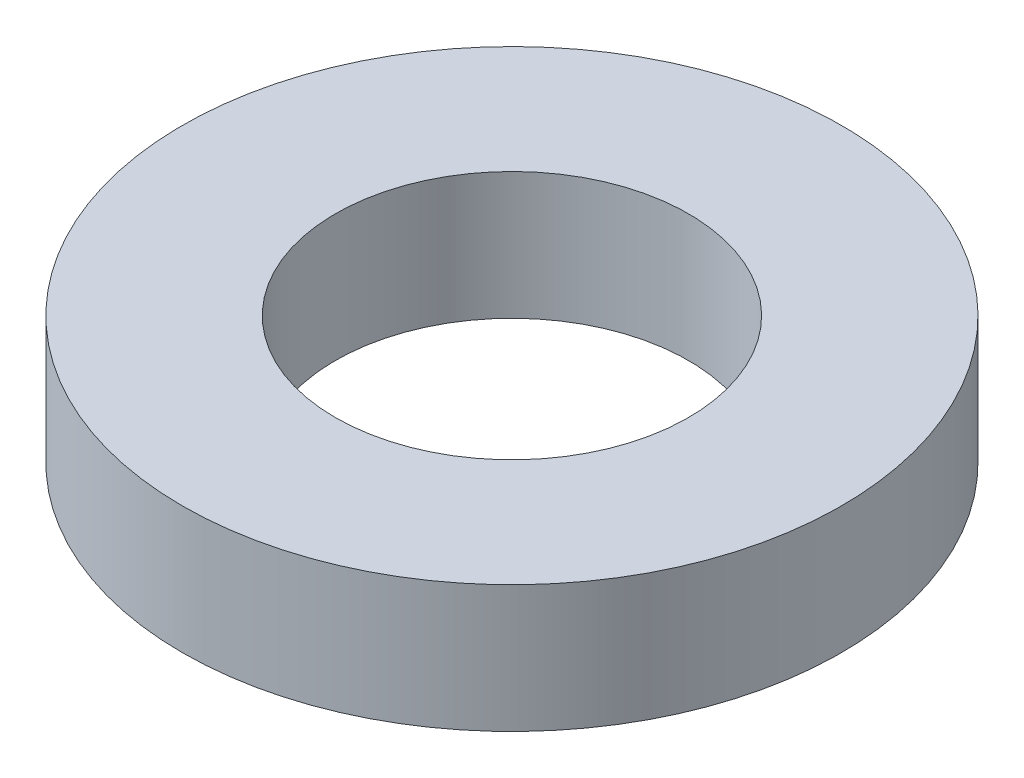
ISO-10303-21;
HEADER;
FILE_DESCRIPTION(('STEP AP214'),'2;1');
FILE_NAME('part.step','',(''),(''),'','','');
FILE_SCHEMA(('AUTOMOTIVE_DESIGN { 1 0 10303 214 1 1 1 1 }'));
ENDSEC;
DATA;
#1=APPLICATION_CONTEXT('core data for automotive mechanical design processes');
#2=APPLICATION_PROTOCOL_DEFINITION('international standard','automotive_design',2000,#1);
#3=PRODUCT_CONTEXT('',#1,'mechanical');
#4=PRODUCT('Part','Part','',(#3));
#5=PRODUCT_RELATED_PRODUCT_CATEGORY('part','',(#4));
#6=PRODUCT_DEFINITION_FORMATION('','',#4);
#7=PRODUCT_DEFINITION_CONTEXT('part definition',#1,'design');
#8=PRODUCT_DEFINITION('design','',#6,#7);
#9=PRODUCT_DEFINITION_SHAPE('','',#8);
#10=(LENGTH_UNIT() NAMED_UNIT(*) SI_UNIT(.MILLI.,.METRE.));
#11=(NAMED_UNIT(*) PLANE_ANGLE_UNIT() SI_UNIT($,.RADIAN.));
#12=(NAMED_UNIT(*) SI_UNIT($,.STERADIAN.) SOLID_ANGLE_UNIT());
#13=UNCERTAINTY_MEASURE_WITH_UNIT(LENGTH_MEASURE(1.E-05),#10,'distance_accuracy_value','');
#14=(GEOMETRIC_REPRESENTATION_CONTEXT(3) GLOBAL_UNCERTAINTY_ASSIGNED_CONTEXT((#13)) GLOBAL_UNIT_ASSIGNED_CONTEXT((#10,
#11,#12)) REPRESENTATION_CONTEXT('',''));
#15=CARTESIAN_POINT('',(0.,0.,0.));
#16=DIRECTION('',(0.,0.,1.));
#17=DIRECTION('',(1.,0.,0.));
#18=AXIS2_PLACEMENT_3D('',#15,#16,#17);
#19=CARTESIAN_POINT('',(0.,3.429,0.));
#20=DIRECTION('',(0.,-1.,0.));
#21=DIRECTION('',(0.,0.,-1.));
#22=AXIS2_PLACEMENT_3D('',#19,#20,#21);
#23=CYLINDRICAL_SURFACE('',#22,8.89);
#24=CARTESIAN_POINT('',(0.,3.429,0.));
#25=DIRECTION('',(0.,1.,0.));
#26=DIRECTION('',(0.,0.,1.));
#27=AXIS2_PLACEMENT_3D('',#24,#25,#26);
#28=CIRCLE('',#27,8.89);
#29=CARTESIAN_POINT('',(0.,3.429,8.89));
#30=VERTEX_POINT('',#29);
#31=EDGE_CURVE('E10',#30,#30,#28,.T.);
#32=ORIENTED_EDGE('',*,*,#31,.F.);
#33=EDGE_LOOP('',(#32));
#34=FACE_BOUND('',#33,.T.);
#35=CARTESIAN_POINT('',(0.,0.,0.));
#36=DIRECTION('',(0.,1.,0.));
#37=DIRECTION('',(0.,0.,1.));
#38=AXIS2_PLACEMENT_3D('',#35,#36,#37);
#39=CIRCLE('',#38,8.89);
#40=CARTESIAN_POINT('',(0.,0.,8.89));
#41=VERTEX_POINT('',#40);
#42=EDGE_CURVE('E40',#41,#41,#39,.T.);
#43=ORIENTED_EDGE('',*,*,#42,.T.);
#44=EDGE_LOOP('',(#43));
#45=FACE_BOUND('',#44,.T.);
#46=ADVANCED_FACE('F37',(#34,#45),#23,.T.);
#47=CARTESIAN_POINT('',(0.,3.429,0.));
#48=DIRECTION('',(0.,1.,0.));
#49=DIRECTION('',(0.,0.,1.));
#50=AXIS2_PLACEMENT_3D('',#47,#48,#49);
#51=PLANE('',#50);
#52=CARTESIAN_POINT('',(0.,3.429,0.));
#53=DIRECTION('',(0.,1.,0.));
#54=DIRECTION('',(0.,0.,1.));
#55=AXIS2_PLACEMENT_3D('',#52,#53,#54);
#56=CIRCLE('',#55,4.7625);
#57=CARTESIAN_POINT('',(0.,3.429,4.7625));
#58=VERTEX_POINT('',#57);
#59=EDGE_CURVE('E54',#58,#58,#56,.T.);
#60=ORIENTED_EDGE('',*,*,#59,.F.);
#61=EDGE_LOOP('',(#60));
#62=FACE_BOUND('',#61,.T.);
#63=ORIENTED_EDGE('',*,*,#31,.T.);
#64=EDGE_LOOP('',(#63));
#65=FACE_BOUND('',#64,.T.);
#66=ADVANCED_FACE('F61',(#62,#65),#51,.T.);
#67=CARTESIAN_POINT('',(0.,0.,0.));
#68=DIRECTION('',(0.,1.,0.));
#69=DIRECTION('',(0.,0.,1.));
#70=AXIS2_PLACEMENT_3D('',#67,#68,#69);
#71=PLANE('',#70);
#72=CARTESIAN_POINT('',(0.,0.,0.));
#73=DIRECTION('',(0.,1.,0.));
#74=DIRECTION('',(0.,0.,1.));
#75=AXIS2_PLACEMENT_3D('',#72,#73,#74);
#76=CIRCLE('',#75,4.7625);
#77=CARTESIAN_POINT('',(0.,0.,4.7625));
#78=VERTEX_POINT('',#77);
#79=EDGE_CURVE('E49',#78,#78,#76,.F.);
#80=ORIENTED_EDGE('',*,*,#79,.F.);
#81=EDGE_LOOP('',(#80));
#82=FACE_BOUND('',#81,.T.);
#83=ORIENTED_EDGE('',*,*,#42,.F.);
#84=EDGE_LOOP('',(#83));
#85=FACE_BOUND('',#84,.T.);
#86=ADVANCED_FACE('F63',(#82,#85),#71,.F.);
#87=CARTESIAN_POINT('',(0.,-13.4703841816037,0.));
#88=DIRECTION('',(0.,1.,0.));
#89=DIRECTION('',(0.,0.,1.));
#90=AXIS2_PLACEMENT_3D('',#87,#88,#89);
#91=CYLINDRICAL_SURFACE('',#90,4.7625);
#92=ORIENTED_EDGE('',*,*,#79,.T.);
#93=EDGE_LOOP('',(#92));
#94=FACE_BOUND('',#93,.T.);
#95=ORIENTED_EDGE('',*,*,#59,.T.);
#96=EDGE_LOOP('',(#95));
#97=FACE_BOUND('',#96,.T.);
#98=ADVANCED_FACE('F59',(#94,#97),#91,.F.);
#99=CLOSED_SHELL('',(#46,#66,#86,#98));
#100=MANIFOLD_SOLID_BREP('B2',#99);
#101=ADVANCED_BREP_SHAPE_REPRESENTATION('',(#18,#100),#14);
#102=SHAPE_DEFINITION_REPRESENTATION(#9,#101);
ENDSEC;
END-ISO-10303-21;
